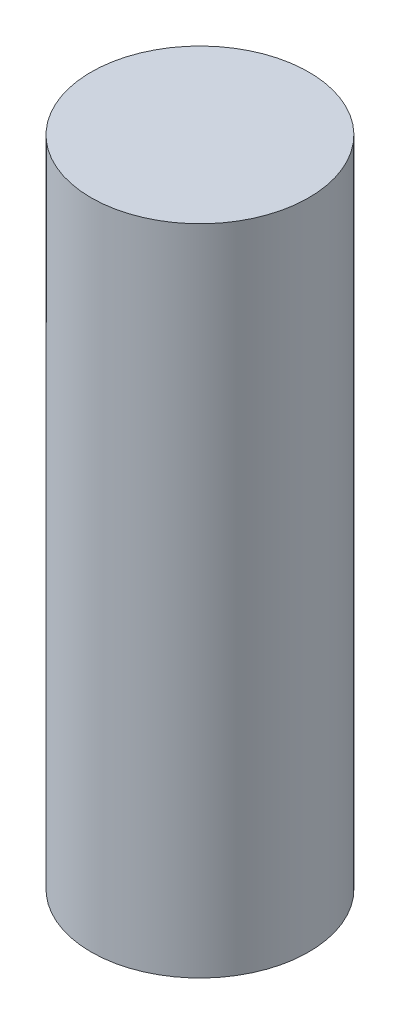
ISO-10303-21;
HEADER;
FILE_DESCRIPTION(('STEP AP214'),'2;1');
FILE_NAME('part.step','',(''),(''),'','','');
FILE_SCHEMA(('AUTOMOTIVE_DESIGN { 1 0 10303 214 1 1 1 1 }'));
ENDSEC;
DATA;
#1=APPLICATION_CONTEXT('core data for automotive mechanical design processes');
#2=APPLICATION_PROTOCOL_DEFINITION('international standard','automotive_design',2000,#1);
#3=PRODUCT_CONTEXT('',#1,'mechanical');
#4=PRODUCT('Part','Part','',(#3));
#5=PRODUCT_RELATED_PRODUCT_CATEGORY('part','',(#4));
#6=PRODUCT_DEFINITION_FORMATION('','',#4);
#7=PRODUCT_DEFINITION_CONTEXT('part definition',#1,'design');
#8=PRODUCT_DEFINITION('design','',#6,#7);
#9=PRODUCT_DEFINITION_SHAPE('','',#8);
#10=(LENGTH_UNIT() NAMED_UNIT(*) SI_UNIT(.MILLI.,.METRE.));
#11=(NAMED_UNIT(*) PLANE_ANGLE_UNIT() SI_UNIT($,.RADIAN.));
#12=(NAMED_UNIT(*) SI_UNIT($,.STERADIAN.) SOLID_ANGLE_UNIT());
#13=UNCERTAINTY_MEASURE_WITH_UNIT(LENGTH_MEASURE(1.E-05),#10,'distance_accuracy_value','');
#14=(GEOMETRIC_REPRESENTATION_CONTEXT(3) GLOBAL_UNCERTAINTY_ASSIGNED_CONTEXT((#13)) GLOBAL_UNIT_ASSIGNED_CONTEXT((#10,
#11,#12)) REPRESENTATION_CONTEXT('',''));
#15=CARTESIAN_POINT('',(0.,0.,0.));
#16=DIRECTION('',(0.,0.,1.));
#17=DIRECTION('',(1.,0.,0.));
#18=AXIS2_PLACEMENT_3D('',#15,#16,#17);
#19=CARTESIAN_POINT('',(0.,381.,0.));
#20=DIRECTION('',(0.,-1.,0.));
#21=DIRECTION('',(0.,0.,-1.));
#22=AXIS2_PLACEMENT_3D('',#19,#20,#21);
#23=CYLINDRICAL_SURFACE('',#22,63.5);
#24=CARTESIAN_POINT('',(0.,381.,0.));
#25=DIRECTION('',(0.,1.,0.));
#26=DIRECTION('',(0.,0.,1.));
#27=AXIS2_PLACEMENT_3D('',#24,#25,#26);
#28=CIRCLE('',#27,63.5);
#29=CARTESIAN_POINT('',(0.,381.,63.5));
#30=VERTEX_POINT('',#29);
#31=EDGE_CURVE('E10',#30,#30,#28,.T.);
#32=ORIENTED_EDGE('',*,*,#31,.F.);
#33=EDGE_LOOP('',(#32));
#34=FACE_BOUND('',#33,.T.);
#35=CARTESIAN_POINT('',(0.,0.,0.));
#36=DIRECTION('',(0.,1.,0.));
#37=DIRECTION('',(0.,0.,1.));
#38=AXIS2_PLACEMENT_3D('',#35,#36,#37);
#39=CIRCLE('',#38,63.5);
#40=CARTESIAN_POINT('',(0.,0.,63.5));
#41=VERTEX_POINT('',#40);
#42=EDGE_CURVE('E37',#41,#41,#39,.T.);
#43=ORIENTED_EDGE('',*,*,#42,.T.);
#44=EDGE_LOOP('',(#43));
#45=FACE_BOUND('',#44,.T.);
#46=ADVANCED_FACE('F40',(#34,#45),#23,.T.);
#47=CARTESIAN_POINT('',(0.,381.,0.));
#48=DIRECTION('',(0.,1.,0.));
#49=DIRECTION('',(0.,0.,1.));
#50=AXIS2_PLACEMENT_3D('',#47,#48,#49);
#51=PLANE('',#50);
#52=ORIENTED_EDGE('',*,*,#31,.T.);
#53=EDGE_LOOP('',(#52));
#54=FACE_BOUND('',#53,.T.);
#55=ADVANCED_FACE('F55',(#54),#51,.T.);
#56=CARTESIAN_POINT('',(0.,0.,0.));
#57=DIRECTION('',(0.,1.,0.));
#58=DIRECTION('',(0.,0.,1.));
#59=AXIS2_PLACEMENT_3D('',#56,#57,#58);
#60=PLANE('',#59);
#61=ORIENTED_EDGE('',*,*,#42,.F.);
#62=EDGE_LOOP('',(#61));
#63=FACE_BOUND('',#62,.T.);
#64=ADVANCED_FACE('F49',(#63),#60,.F.);
#65=CLOSED_SHELL('',(#46,#55,#64));
#66=MANIFOLD_SOLID_BREP('B2',#65);
#67=ADVANCED_BREP_SHAPE_REPRESENTATION('',(#18,#66),#14);
#68=SHAPE_DEFINITION_REPRESENTATION(#9,#67);
ENDSEC;
END-ISO-10303-21;
